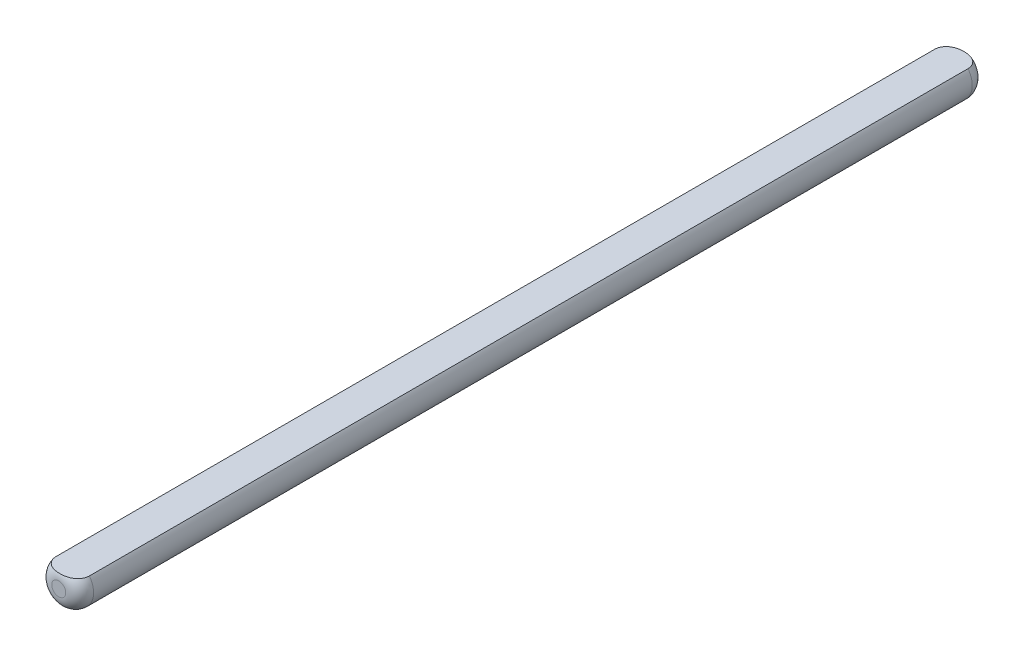
ISO-10303-21;
HEADER;
FILE_DESCRIPTION(('STEP AP214'),'2;1');
FILE_NAME('part.step','',(''),(''),'','','');
FILE_SCHEMA(('AUTOMOTIVE_DESIGN { 1 0 10303 214 1 1 1 1 }'));
ENDSEC;
DATA;
#1=APPLICATION_CONTEXT('core data for automotive mechanical design processes');
#2=APPLICATION_PROTOCOL_DEFINITION('international standard','automotive_design',2000,#1);
#3=PRODUCT_CONTEXT('',#1,'mechanical');
#4=PRODUCT('Part','Part','',(#3));
#5=PRODUCT_RELATED_PRODUCT_CATEGORY('part','',(#4));
#6=PRODUCT_DEFINITION_FORMATION('','',#4);
#7=PRODUCT_DEFINITION_CONTEXT('part definition',#1,'design');
#8=PRODUCT_DEFINITION('design','',#6,#7);
#9=PRODUCT_DEFINITION_SHAPE('','',#8);
#10=(LENGTH_UNIT() NAMED_UNIT(*) SI_UNIT(.MILLI.,.METRE.));
#11=(NAMED_UNIT(*) PLANE_ANGLE_UNIT() SI_UNIT($,.RADIAN.));
#12=(NAMED_UNIT(*) SI_UNIT($,.STERADIAN.) SOLID_ANGLE_UNIT());
#13=UNCERTAINTY_MEASURE_WITH_UNIT(LENGTH_MEASURE(1.E-05),#10,'distance_accuracy_value','');
#14=(GEOMETRIC_REPRESENTATION_CONTEXT(3) GLOBAL_UNCERTAINTY_ASSIGNED_CONTEXT((#13)) GLOBAL_UNIT_ASSIGNED_CONTEXT((#10,
#11,#12)) REPRESENTATION_CONTEXT('',''));
#15=CARTESIAN_POINT('',(0.,0.,0.));
#16=DIRECTION('',(0.,0.,1.));
#17=DIRECTION('',(1.,0.,0.));
#18=AXIS2_PLACEMENT_3D('',#15,#16,#17);
#19=CARTESIAN_POINT('',(0.,0.,130.));
#20=DIRECTION('',(0.,0.,-1.));
#21=DIRECTION('',(-1.,0.,0.));
#22=AXIS2_PLACEMENT_3D('',#19,#20,#21);
#23=CYLINDRICAL_SURFACE('',#22,3.);
#24=CARTESIAN_POINT('',(0.,0.,128.));
#25=DIRECTION('',(0.,0.,1.));
#26=DIRECTION('',(1.,0.,0.));
#27=AXIS2_PLACEMENT_3D('',#24,#25,#26);
#28=CIRCLE('',#27,3.);
#29=CARTESIAN_POINT('',(2.4,1.8,128.));
#30=VERTEX_POINT('',#29);
#31=CARTESIAN_POINT('',(-2.4,1.8,128.));
#32=VERTEX_POINT('',#31);
#33=EDGE_CURVE('E75',#30,#32,#28,.F.);
#34=ORIENTED_EDGE('',*,*,#33,.T.);
#35=DIRECTION('',(0.,0.,-1.));
#36=VECTOR('',#35,1.);
#37=CARTESIAN_POINT('',(-2.4,1.8,130.));
#38=LINE('',#37,#36);
#39=CARTESIAN_POINT('',(-2.4,1.8,2.));
#40=VERTEX_POINT('',#39);
#41=EDGE_CURVE('E58',#32,#40,#38,.T.);
#42=ORIENTED_EDGE('',*,*,#41,.T.);
#43=CARTESIAN_POINT('',(0.,0.,2.));
#44=DIRECTION('',(0.,0.,1.));
#45=DIRECTION('',(1.,0.,0.));
#46=AXIS2_PLACEMENT_3D('',#43,#44,#45);
#47=CIRCLE('',#46,3.);
#48=CARTESIAN_POINT('',(2.4,1.8,2.));
#49=VERTEX_POINT('',#48);
#50=EDGE_CURVE('E77',#40,#49,#47,.T.);
#51=ORIENTED_EDGE('',*,*,#50,.T.);
#52=DIRECTION('',(0.,0.,-1.));
#53=VECTOR('',#52,1.);
#54=CARTESIAN_POINT('',(2.4,1.8,130.));
#55=LINE('',#54,#53);
#56=EDGE_CURVE('E69',#49,#30,#55,.F.);
#57=ORIENTED_EDGE('',*,*,#56,.T.);
#58=EDGE_LOOP('',(#34,#42,#51,#57));
#59=FACE_BOUND('',#58,.T.);
#60=ADVANCED_FACE('F39',(#59),#23,.T.);
#61=CARTESIAN_POINT('',(0.,0.,130.));
#62=DIRECTION('',(0.,0.,1.));
#63=DIRECTION('',(1.,0.,0.));
#64=AXIS2_PLACEMENT_3D('',#61,#62,#63);
#65=PLANE('',#64);
#66=CARTESIAN_POINT('',(0.,0.,130.));
#67=DIRECTION('',(0.,0.,1.));
#68=DIRECTION('',(1.,0.,0.));
#69=AXIS2_PLACEMENT_3D('',#66,#67,#68);
#70=CIRCLE('',#69,1.);
#71=CARTESIAN_POINT('',(1.,0.,130.));
#72=VERTEX_POINT('',#71);
#73=EDGE_CURVE('E52',#72,#72,#70,.T.);
#74=ORIENTED_EDGE('',*,*,#73,.T.);
#75=EDGE_LOOP('',(#74));
#76=FACE_BOUND('',#75,.T.);
#77=ADVANCED_FACE('F93',(#76),#65,.T.);
#78=CARTESIAN_POINT('',(0.,0.,0.));
#79=DIRECTION('',(0.,0.,1.));
#80=DIRECTION('',(1.,0.,0.));
#81=AXIS2_PLACEMENT_3D('',#78,#79,#80);
#82=PLANE('',#81);
#83=CARTESIAN_POINT('',(0.,0.,0.));
#84=DIRECTION('',(0.,0.,1.));
#85=DIRECTION('',(1.,0.,0.));
#86=AXIS2_PLACEMENT_3D('',#83,#84,#85);
#87=CIRCLE('',#86,1.);
#88=CARTESIAN_POINT('',(1.,0.,0.));
#89=VERTEX_POINT('',#88);
#90=EDGE_CURVE('E81',#89,#89,#87,.F.);
#91=ORIENTED_EDGE('',*,*,#90,.T.);
#92=EDGE_LOOP('',(#91));
#93=FACE_BOUND('',#92,.T.);
#94=ADVANCED_FACE('F100',(#93),#82,.F.);
#95=CARTESIAN_POINT('',(0.,0.,2.));
#96=DIRECTION('',(0.,0.,1.));
#97=DIRECTION('',(1.,0.,0.));
#98=AXIS2_PLACEMENT_3D('',#95,#96,#97);
#99=DEGENERATE_TOROIDAL_SURFACE('',#98,1.,2.,.T.);
#100=CARTESIAN_POINT('',(0.,1.8,0.166969722017666));
#101=CARTESIAN_POINT('',(-0.0986785998941134,1.8,0.166975238087045));
#102=CARTESIAN_POINT('',(-0.197346529839382,1.8,0.170477675450817));
#103=CARTESIAN_POINT('',(-0.394209548449965,1.8,0.184913042187482));
#104=CARTESIAN_POINT('',(-0.492404397458323,1.8,0.195849405599045));
#105=CARTESIAN_POINT('',(-0.68720081067676,1.8,0.226181270819594));
#106=CARTESIAN_POINT('',(-0.783806454655332,1.8,0.245549708164188));
#107=CARTESIAN_POINT('',(-0.974465262182511,1.8,0.294071757687691));
#108=CARTESIAN_POINT('',(-1.06852108624494,1.8,0.323214710018872));
#109=CARTESIAN_POINT('',(-1.26583029774225,1.8,0.397560041627408));
#110=CARTESIAN_POINT('',(-1.36845768235951,1.8,0.444470717419789));
#111=CARTESIAN_POINT('',(-1.56509122123428,1.8,0.553888295113033));
#112=CARTESIAN_POINT('',(-1.65910198708867,1.8,0.616386787004061));
#113=CARTESIAN_POINT('',(-1.83552651616728,1.8,0.757508666797526));
#114=CARTESIAN_POINT('',(-1.91784068816743,1.8,0.836257975190657));
#115=CARTESIAN_POINT('',(-2.065979104658,1.8,1.00807150942055));
#116=CARTESIAN_POINT('',(-2.13180888155012,1.8,1.10113091561127));
#117=CARTESIAN_POINT('',(-2.23720083061211,1.8,1.28754255388353));
#118=CARTESIAN_POINT('',(-2.27887474437677,1.8,1.3797028054003));
#119=CARTESIAN_POINT('',(-2.34452577229867,1.8,1.57011541648018));
#120=CARTESIAN_POINT('',(-2.36851347657191,1.8,1.66836409215646));
#121=CARTESIAN_POINT('',(-2.39644764661969,1.8,1.85915363798996));
#122=CARTESIAN_POINT('',(-2.40191765680888,1.8,1.95147438490739));
#123=CARTESIAN_POINT('',(-2.39689553554796,1.8,2.13567111565641));
#124=CARTESIAN_POINT('',(-2.38640678592952,1.8,2.2275471895803));
#125=CARTESIAN_POINT('',(-2.35030117415979,1.8,2.40613408615349));
#126=CARTESIAN_POINT('',(-2.32502501802913,1.8,2.49291427573677));
#127=CARTESIAN_POINT('',(-2.26058356546414,1.8,2.66113019876751));
#128=CARTESIAN_POINT('',(-2.22141882918956,1.8,2.74256614760406));
#129=CARTESIAN_POINT('',(-2.12955683902653,1.8,2.89994959923916));
#130=CARTESIAN_POINT('',(-2.07656511403947,1.8,2.97572467287087));
#131=CARTESIAN_POINT('',(-1.95939791386091,1.8,3.11806122730967));
#132=CARTESIAN_POINT('',(-1.89521774629078,1.8,3.18461882125054));
#133=CARTESIAN_POINT('',(-1.75271671613515,1.8,3.31204250166765));
#134=CARTESIAN_POINT('',(-1.67370313469296,1.8,3.37213038880669));
#135=CARTESIAN_POINT('',(-1.50786459976306,1.8,3.48010981150634));
#136=CARTESIAN_POINT('',(-1.42104320451761,1.8,3.52800686503826));
#137=CARTESIAN_POINT('',(-1.26390306676421,1.8,3.60175998818603));
#138=CARTESIAN_POINT('',(-1.19474255503857,1.8,3.63014162439646));
#139=CARTESIAN_POINT('',(-1.05416593877488,1.8,3.68063819903391));
#140=CARTESIAN_POINT('',(-0.982749379954744,1.8,3.70275186627457));
#141=CARTESIAN_POINT('',(-0.838034036058117,1.8,3.74134266505989));
#142=CARTESIAN_POINT('',(-0.76472741262721,1.8,3.75778998184676));
#143=CARTESIAN_POINT('',(-0.617157947681998,1.8,3.78549164477229));
#144=CARTESIAN_POINT('',(-0.542895096326035,1.8,3.7967459374195));
#145=CARTESIAN_POINT('',(-0.358348827697383,1.8,3.81888706504936));
#146=CARTESIAN_POINT('',(-0.247737219781189,1.8,3.82705178049354));
#147=CARTESIAN_POINT('',(-0.0261563081097727,1.8,3.83445046479966));
#148=CARTESIAN_POINT('',(0.0848132146458739,1.8,3.83367710165681));
#149=CARTESIAN_POINT('',(0.306020069167073,1.8,3.82307860982982));
#150=CARTESIAN_POINT('',(0.416258594625243,1.8,3.8132801259526));
#151=CARTESIAN_POINT('',(0.635242041818319,1.8,3.7833889265005));
#152=CARTESIAN_POINT('',(0.74398862547722,1.8,3.76330881655314));
#153=CARTESIAN_POINT('',(0.970440557346135,1.8,3.70805597598123));
#154=CARTESIAN_POINT('',(1.08781482330207,1.8,3.6714655182648));
#155=CARTESIAN_POINT('',(1.31559913991839,1.8,3.58089149859709));
#156=CARTESIAN_POINT('',(1.42602039299972,1.8,3.52693681748993));
#157=CARTESIAN_POINT('',(1.63698214306462,1.8,3.39965509628724));
#158=CARTESIAN_POINT('',(1.73739712118393,1.8,3.32611638038127));
#159=CARTESIAN_POINT('',(1.92177182460297,1.8,3.16048672940832));
#160=CARTESIAN_POINT('',(2.00573510880869,1.8,3.06839981553315));
#161=CARTESIAN_POINT('',(2.14170378773492,1.8,2.88268700099884));
#162=CARTESIAN_POINT('',(2.19655590053385,1.8,2.7911424114992));
#163=CARTESIAN_POINT('',(2.28775023694629,1.8,2.59927472144413));
#164=CARTESIAN_POINT('',(2.32410951262713,1.8,2.49895980833114));
#165=CARTESIAN_POINT('',(2.37344556135317,1.8,2.30513950926308));
#166=CARTESIAN_POINT('',(2.38864566212387,1.8,2.2121942845736));
#167=CARTESIAN_POINT('',(2.40254652843964,1.8,2.02508558426061));
#168=CARTESIAN_POINT('',(2.40125250179713,1.8,1.93092250254016));
#169=CARTESIAN_POINT('',(2.38259230347494,1.8,1.74786718588304));
#170=CARTESIAN_POINT('',(2.36584296863454,1.8,1.65891112953878));
#171=CARTESIAN_POINT('',(2.3177948786314,1.8,1.48503513443969));
#172=CARTESIAN_POINT('',(2.28649679833613,1.8,1.40011500867296));
#173=CARTESIAN_POINT('',(2.21011098434111,1.8,1.23563696772895));
#174=CARTESIAN_POINT('',(2.16487938683766,1.8,1.15614609480629));
#175=CARTESIAN_POINT('',(2.06239114822016,1.8,1.00536938877244));
#176=CARTESIAN_POINT('',(2.00513292643795,1.8,0.934084636106138));
#177=CARTESIAN_POINT('',(1.87694794583826,1.8,0.797209267821055));
#178=CARTESIAN_POINT('',(1.80542713631104,1.8,0.732176714614894));
#179=CARTESIAN_POINT('',(1.6535258887066,1.8,0.613512927513511));
#180=CARTESIAN_POINT('',(1.57314145111642,1.8,0.559886872774925));
#181=CARTESIAN_POINT('',(1.37120696379265,1.8,0.444290804678226));
#182=CARTESIAN_POINT('',(1.24637956290656,1.8,0.388040119487766));
#183=CARTESIAN_POINT('',(0.989376682558869,1.8,0.296476142840079));
#184=CARTESIAN_POINT('',(0.857190636952698,1.8,0.261193854321601));
#185=CARTESIAN_POINT('',(0.604491105474044,1.8,0.211015292219229));
#186=CARTESIAN_POINT('',(0.484321810099182,1.8,0.194282993609102));
#187=CARTESIAN_POINT('',(0.242764158095312,1.8,0.172246586378911));
#188=CARTESIAN_POINT('',(0.121374007853963,1.8,0.166962937289783));
#189=CARTESIAN_POINT('',(0.,1.8,0.166969722017666));
#190=B_SPLINE_CURVE_WITH_KNOTS('',3,(#100,#101,#102,#103,#104,#105,#106,#107,#108,#109,#110,
#111,#112,#113,#114,#115,#116,#117,#118,#119,#120,#121,#122,#123,#124,#125,#126,#127,#128,#129,
#130,#131,#132,#133,#134,#135,#136,#137,#138,#139,#140,#141,#142,#143,#144,#145,#146,#147,#148,
#149,#150,#151,#152,#153,#154,#155,#156,#157,#158,#159,#160,#161,#162,#163,#164,#165,#166,#167,
#168,#169,#170,#171,#172,#173,#174,#175,#176,#177,#178,#179,#180,#181,#182,#183,#184,#185,#186,
#187,#188,#189),.UNSPECIFIED.,.T.,.F.,(4,2,2,2,2,2,2,2,2,2,2,2,2,2,2,2,2,2,2,2,2,2,2,2,2,2,2,2,
2,2,2,2,2,2,2,2,2,2,2,2,2,2,2,2,4),(0.,0.295949653695498,0.592036111796913,0.887179146832613,
1.18200134704731,1.51927976293908,1.85637660099008,2.19619075075287,2.5358907006511,
2.83767550406189,3.13927945824436,3.41537263411145,3.6914073110335,3.96131945882432,
4.2312207216487,4.50742049637946,4.78373638786554,5.0803670815448,5.3768632707044,
5.60083274182996,5.82484760302654,6.05002378312748,6.27520228263474,6.60750999736436,
6.9400903271253,7.2716919184159,7.60288792476429,7.97053125870932,8.33756624716975,
8.70874180895325,9.07983698747111,9.39815717912841,9.71618331622703,9.99731399926407,
10.278355921038,10.5486447906642,10.8189211237476,11.0920873088679,11.3652894189135,
11.6541014321146,11.9430443027048,12.351468674033,12.7604954307166,13.1238626665679,
13.4878787311509),.UNSPECIFIED.);
#191=EDGE_CURVE('E63',#49,#40,#190,.T.);
#192=ORIENTED_EDGE('',*,*,#191,.F.);
#193=ORIENTED_EDGE('',*,*,#50,.F.);
#194=EDGE_LOOP('',(#192,#193));
#195=FACE_BOUND('',#194,.T.);
#196=ORIENTED_EDGE('',*,*,#90,.F.);
#197=EDGE_LOOP('',(#196));
#198=FACE_BOUND('',#197,.T.);
#199=ADVANCED_FACE('F95',(#195,#198),#99,.T.);
#200=CARTESIAN_POINT('',(0.,0.,128.));
#201=DIRECTION('',(0.,0.,1.));
#202=DIRECTION('',(1.,0.,0.));
#203=AXIS2_PLACEMENT_3D('',#200,#201,#202);
#204=DEGENERATE_TOROIDAL_SURFACE('',#203,1.,2.,.T.);
#205=CARTESIAN_POINT('',(0.,1.8,129.833030277982));
#206=CARTESIAN_POINT('',(0.0986785998941123,1.8,129.833024761913));
#207=CARTESIAN_POINT('',(0.19734652983938,1.8,129.829522324549));
#208=CARTESIAN_POINT('',(0.394209548449963,1.8,129.815086957813));
#209=CARTESIAN_POINT('',(0.492404397458321,1.8,129.804150594401));
#210=CARTESIAN_POINT('',(0.687200810676758,1.8,129.77381872918));
#211=CARTESIAN_POINT('',(0.783806454655327,1.8,129.754450291836));
#212=CARTESIAN_POINT('',(0.974465262182507,1.8,129.705928242312));
#213=CARTESIAN_POINT('',(1.06852108624494,1.8,129.676785289981));
#214=CARTESIAN_POINT('',(1.26583029774225,1.8,129.602439958373));
#215=CARTESIAN_POINT('',(1.36845768235951,1.8,129.55552928258));
#216=CARTESIAN_POINT('',(1.56509122123427,1.8,129.446111704887));
#217=CARTESIAN_POINT('',(1.65910198708867,1.8,129.383613212996));
#218=CARTESIAN_POINT('',(1.83552651616729,1.8,129.242491333202));
#219=CARTESIAN_POINT('',(1.91784068816743,1.8,129.163742024809));
#220=CARTESIAN_POINT('',(2.065979104658,1.8,128.991928490579));
#221=CARTESIAN_POINT('',(2.13180888155013,1.8,128.898869084389));
#222=CARTESIAN_POINT('',(2.23720083061211,1.8,128.712457446116));
#223=CARTESIAN_POINT('',(2.27887474437677,1.8,128.6202971946));
#224=CARTESIAN_POINT('',(2.34452577229868,1.8,128.42988458352));
#225=CARTESIAN_POINT('',(2.36851347657191,1.8,128.331635907844));
#226=CARTESIAN_POINT('',(2.39644764661969,1.8,128.14084636201));
#227=CARTESIAN_POINT('',(2.40191765680888,1.8,128.048525615093));
#228=CARTESIAN_POINT('',(2.39689553554796,1.8,127.864328884344));
#229=CARTESIAN_POINT('',(2.38640678592952,1.8,127.77245281042));
#230=CARTESIAN_POINT('',(2.35030117415979,1.8,127.593865913846));
#231=CARTESIAN_POINT('',(2.32502501802913,1.8,127.507085724263));
#232=CARTESIAN_POINT('',(2.26058356546413,1.8,127.338869801232));
#233=CARTESIAN_POINT('',(2.22141882918955,1.8,127.257433852396));
#234=CARTESIAN_POINT('',(2.12955683902652,1.8,127.100050400761));
#235=CARTESIAN_POINT('',(2.07656511403947,1.8,127.024275327129));
#236=CARTESIAN_POINT('',(1.9593979138609,1.8,126.88193877269));
#237=CARTESIAN_POINT('',(1.89521774629078,1.8,126.815381178749));
#238=CARTESIAN_POINT('',(1.75271671613514,1.8,126.687957498332));
#239=CARTESIAN_POINT('',(1.67370313469295,1.8,126.627869611193));
#240=CARTESIAN_POINT('',(1.50786459976304,1.8,126.519890188494));
#241=CARTESIAN_POINT('',(1.4210432045176,1.8,126.471993134962));
#242=CARTESIAN_POINT('',(1.2639030667642,1.8,126.398240011814));
#243=CARTESIAN_POINT('',(1.19474255503856,1.8,126.369858375604));
#244=CARTESIAN_POINT('',(1.05416593877488,1.8,126.319361800966));
#245=CARTESIAN_POINT('',(0.982749379954742,1.8,126.297248133725));
#246=CARTESIAN_POINT('',(0.838034036058111,1.8,126.25865733494));
#247=CARTESIAN_POINT('',(0.7647274126272,1.8,126.242210018153));
#248=CARTESIAN_POINT('',(0.617157947681986,1.8,126.214508355228));
#249=CARTESIAN_POINT('',(0.542895096326025,1.8,126.203254062581));
#250=CARTESIAN_POINT('',(0.358348827697375,1.8,126.181112934951));
#251=CARTESIAN_POINT('',(0.24773721978118,1.8,126.172948219506));
#252=CARTESIAN_POINT('',(0.0261563081097636,1.8,126.1655495352));
#253=CARTESIAN_POINT('',(-0.0848132146458825,1.8,126.166322898343));
#254=CARTESIAN_POINT('',(-0.306020069167082,1.8,126.17692139017));
#255=CARTESIAN_POINT('',(-0.416258594625251,1.8,126.186719874047));
#256=CARTESIAN_POINT('',(-0.635242041818326,1.8,126.2166110735));
#257=CARTESIAN_POINT('',(-0.743988625477226,1.8,126.236691183447));
#258=CARTESIAN_POINT('',(-0.970440557346138,1.8,126.291944024019));
#259=CARTESIAN_POINT('',(-1.08781482330207,1.8,126.328534481735));
#260=CARTESIAN_POINT('',(-1.31559913991839,1.8,126.419108501403));
#261=CARTESIAN_POINT('',(-1.42602039299972,1.8,126.47306318251));
#262=CARTESIAN_POINT('',(-1.63698214306463,1.8,126.600344903713));
#263=CARTESIAN_POINT('',(-1.73739712118393,1.8,126.673883619619));
#264=CARTESIAN_POINT('',(-1.92177182460299,1.8,126.839513270592));
#265=CARTESIAN_POINT('',(-2.0057351088087,1.8,126.931600184467));
#266=CARTESIAN_POINT('',(-2.14170378773493,1.8,127.117312999001));
#267=CARTESIAN_POINT('',(-2.19655590053386,1.8,127.208857588501));
#268=CARTESIAN_POINT('',(-2.28775023694629,1.8,127.400725278556));
#269=CARTESIAN_POINT('',(-2.32410951262713,1.8,127.501040191669));
#270=CARTESIAN_POINT('',(-2.37344556135318,1.8,127.694860490737));
#271=CARTESIAN_POINT('',(-2.38864566212387,1.8,127.787805715426));
#272=CARTESIAN_POINT('',(-2.40254652843964,1.8,127.974914415739));
#273=CARTESIAN_POINT('',(-2.40125250179712,1.8,128.06907749746));
#274=CARTESIAN_POINT('',(-2.38259230347494,1.8,128.252132814117));
#275=CARTESIAN_POINT('',(-2.36584296863455,1.8,128.341088870461));
#276=CARTESIAN_POINT('',(-2.31779487863141,1.8,128.51496486556));
#277=CARTESIAN_POINT('',(-2.28649679833614,1.8,128.599884991327));
#278=CARTESIAN_POINT('',(-2.21011098434111,1.8,128.764363032271));
#279=CARTESIAN_POINT('',(-2.16487938683766,1.8,128.843853905194));
#280=CARTESIAN_POINT('',(-2.06239114822017,1.8,128.994630611228));
#281=CARTESIAN_POINT('',(-2.00513292643796,1.8,129.065915363894));
#282=CARTESIAN_POINT('',(-1.87694794583828,1.8,129.202790732179));
#283=CARTESIAN_POINT('',(-1.80542713631105,1.8,129.267823285385));
#284=CARTESIAN_POINT('',(-1.6535258887066,1.8,129.386487072487));
#285=CARTESIAN_POINT('',(-1.57314145111641,1.8,129.440113127225));
#286=CARTESIAN_POINT('',(-1.37120696379265,1.8,129.555709195322));
#287=CARTESIAN_POINT('',(-1.24637956290655,1.8,129.611959880512));
#288=CARTESIAN_POINT('',(-0.98937668255886,1.8,129.70352385716));
#289=CARTESIAN_POINT('',(-0.857190636952684,1.8,129.738806145678));
#290=CARTESIAN_POINT('',(-0.604491105474029,1.8,129.788984707781));
#291=CARTESIAN_POINT('',(-0.48432181009917,1.8,129.805717006391));
#292=CARTESIAN_POINT('',(-0.242764158095306,1.8,129.827753413621));
#293=CARTESIAN_POINT('',(-0.12137400785396,1.8,129.83303706271));
#294=CARTESIAN_POINT('',(0.,1.8,129.833030277982));
#295=B_SPLINE_CURVE_WITH_KNOTS('',3,(#205,#206,#207,#208,#209,#210,#211,#212,#213,#214,#215,
#216,#217,#218,#219,#220,#221,#222,#223,#224,#225,#226,#227,#228,#229,#230,#231,#232,#233,#234,
#235,#236,#237,#238,#239,#240,#241,#242,#243,#244,#245,#246,#247,#248,#249,#250,#251,#252,#253,
#254,#255,#256,#257,#258,#259,#260,#261,#262,#263,#264,#265,#266,#267,#268,#269,#270,#271,#272,
#273,#274,#275,#276,#277,#278,#279,#280,#281,#282,#283,#284,#285,#286,#287,#288,#289,#290,#291,
#292,#293,#294),.UNSPECIFIED.,.T.,.F.,(4,2,2,2,2,2,2,2,2,2,2,2,2,2,2,2,2,2,2,2,2,2,2,2,2,2,2,2,
2,2,2,2,2,2,2,2,2,2,2,2,2,2,2,2,4),(0.,0.295949653695496,0.59203611179691,0.887179146832611,
1.1820013470473,1.51927976293908,1.85637660099007,2.19619075075287,2.53589070065112,
2.83767550406188,3.13927945824434,3.41537263411145,3.69140731103349,3.96131945882433,
4.23122072164871,4.50742049637948,4.78373638786555,5.08036708154481,5.3768632707044,
5.60083274182997,5.82484760302653,6.05002378312748,6.27520228263474,6.60750999736436,
6.9400903271253,7.2716919184159,7.60288792476429,7.97053125870931,8.33756624716976,
8.70874180895326,9.07983698747112,9.39815717912843,9.71618331622702,9.99731399926408,
10.278355921038,10.5486447906641,10.8189211237476,11.0920873088679,11.3652894189135,
11.6541014321146,11.9430443027048,12.351468674033,12.7604954307166,13.1238626665679,
13.4878787311509),.UNSPECIFIED.);
#296=EDGE_CURVE('E11',#32,#30,#295,.T.);
#297=ORIENTED_EDGE('',*,*,#296,.F.);
#298=ORIENTED_EDGE('',*,*,#33,.F.);
#299=EDGE_LOOP('',(#297,#298));
#300=FACE_BOUND('',#299,.T.);
#301=ORIENTED_EDGE('',*,*,#73,.F.);
#302=EDGE_LOOP('',(#301));
#303=FACE_BOUND('',#302,.T.);
#304=ADVANCED_FACE('F41',(#300,#303),#204,.T.);
#305=CARTESIAN_POINT('',(-3.,1.8,0.));
#306=DIRECTION('',(0.,-1.,0.));
#307=DIRECTION('',(0.,0.,-1.));
#308=AXIS2_PLACEMENT_3D('',#305,#306,#307);
#309=PLANE('',#308);
#310=ORIENTED_EDGE('',*,*,#191,.T.);
#311=ORIENTED_EDGE('',*,*,#41,.F.);
#312=ORIENTED_EDGE('',*,*,#296,.T.);
#313=ORIENTED_EDGE('',*,*,#56,.F.);
#314=EDGE_LOOP('',(#310,#311,#312,#313));
#315=FACE_BOUND('',#314,.T.);
#316=ADVANCED_FACE('F68',(#315),#309,.F.);
#317=CLOSED_SHELL('',(#60,#77,#94,#199,#304,#316));
#318=MANIFOLD_SOLID_BREP('B2',#317);
#319=ADVANCED_BREP_SHAPE_REPRESENTATION('',(#18,#318),#14);
#320=SHAPE_DEFINITION_REPRESENTATION(#9,#319);
ENDSEC;
END-ISO-10303-21;
